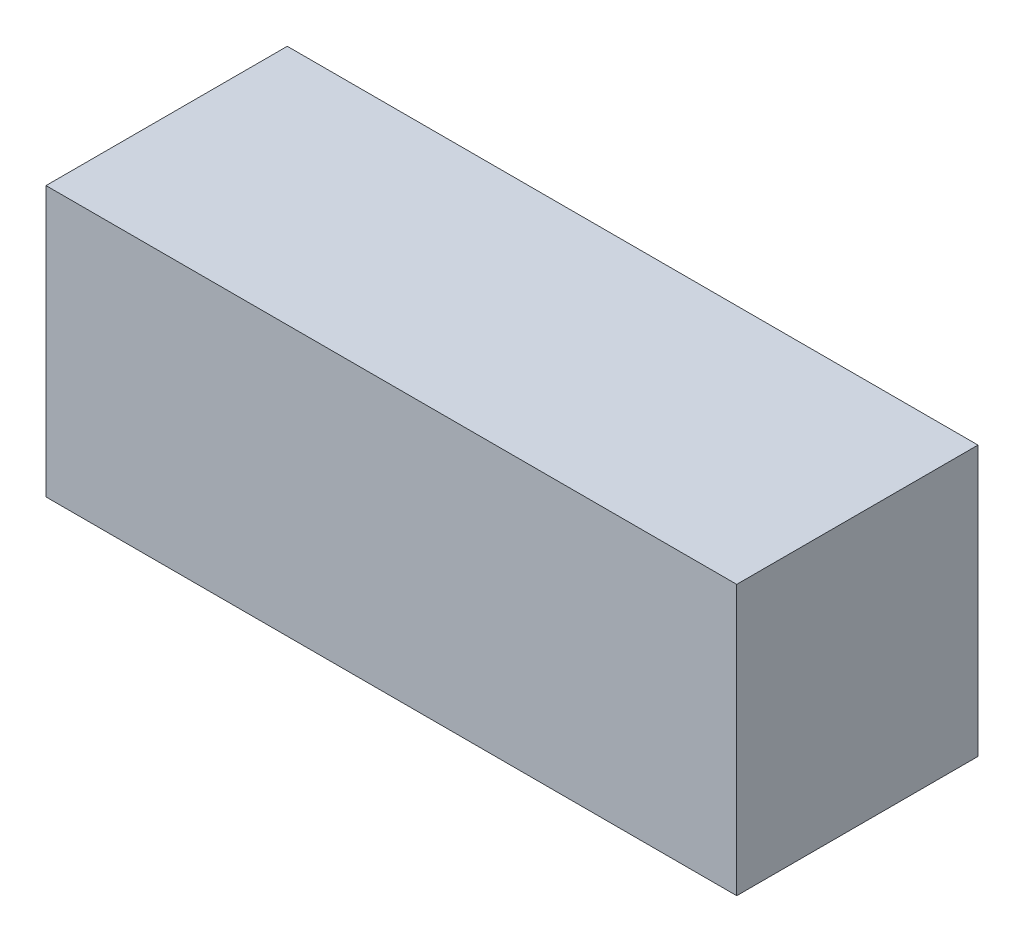
ISO-10303-21;
HEADER;
FILE_DESCRIPTION(('STEP AP214'),'2;1');
FILE_NAME('part.step','',(''),(''),'','','');
FILE_SCHEMA(('AUTOMOTIVE_DESIGN { 1 0 10303 214 1 1 1 1 }'));
ENDSEC;
DATA;
#1=APPLICATION_CONTEXT('core data for automotive mechanical design processes');
#2=APPLICATION_PROTOCOL_DEFINITION('international standard','automotive_design',2000,#1);
#3=PRODUCT_CONTEXT('',#1,'mechanical');
#4=PRODUCT('Part','Part','',(#3));
#5=PRODUCT_RELATED_PRODUCT_CATEGORY('part','',(#4));
#6=PRODUCT_DEFINITION_FORMATION('','',#4);
#7=PRODUCT_DEFINITION_CONTEXT('part definition',#1,'design');
#8=PRODUCT_DEFINITION('design','',#6,#7);
#9=PRODUCT_DEFINITION_SHAPE('','',#8);
#10=(LENGTH_UNIT() NAMED_UNIT(*) SI_UNIT(.MILLI.,.METRE.));
#11=(NAMED_UNIT(*) PLANE_ANGLE_UNIT() SI_UNIT($,.RADIAN.));
#12=(NAMED_UNIT(*) SI_UNIT($,.STERADIAN.) SOLID_ANGLE_UNIT());
#13=UNCERTAINTY_MEASURE_WITH_UNIT(LENGTH_MEASURE(1.E-05),#10,'distance_accuracy_value','');
#14=(GEOMETRIC_REPRESENTATION_CONTEXT(3) GLOBAL_UNCERTAINTY_ASSIGNED_CONTEXT((#13)) GLOBAL_UNIT_ASSIGNED_CONTEXT((#10,
#11,#12)) REPRESENTATION_CONTEXT('',''));
#15=CARTESIAN_POINT('',(0.,0.,0.));
#16=DIRECTION('',(0.,0.,1.));
#17=DIRECTION('',(1.,0.,0.));
#18=AXIS2_PLACEMENT_3D('',#15,#16,#17);
#19=CARTESIAN_POINT('',(0.,57.,0.));
#20=DIRECTION('',(1.,0.,0.));
#21=DIRECTION('',(0.,0.,-1.));
#22=AXIS2_PLACEMENT_3D('',#19,#20,#21);
#23=PLANE('',#22);
#24=DIRECTION('',(0.,0.,1.));
#25=VECTOR('',#24,1.);
#26=CARTESIAN_POINT('',(0.,0.,0.));
#27=LINE('',#26,#25);
#28=CARTESIAN_POINT('',(0.,0.,-51.));
#29=VERTEX_POINT('',#28);
#30=CARTESIAN_POINT('',(0.,0.,0.));
#31=VERTEX_POINT('',#30);
#32=EDGE_CURVE('E96',#29,#31,#27,.T.);
#33=ORIENTED_EDGE('',*,*,#32,.T.);
#34=DIRECTION('',(0.,-1.,0.));
#35=VECTOR('',#34,1.);
#36=CARTESIAN_POINT('',(0.,57.,0.));
#37=LINE('',#36,#35);
#38=CARTESIAN_POINT('',(0.,57.,0.));
#39=VERTEX_POINT('',#38);
#40=EDGE_CURVE('E11',#39,#31,#37,.T.);
#41=ORIENTED_EDGE('',*,*,#40,.F.);
#42=DIRECTION('',(0.,0.,1.));
#43=VECTOR('',#42,1.);
#44=CARTESIAN_POINT('',(0.,57.,0.));
#45=LINE('',#44,#43);
#46=CARTESIAN_POINT('',(0.,57.,-51.));
#47=VERTEX_POINT('',#46);
#48=EDGE_CURVE('E84',#47,#39,#45,.T.);
#49=ORIENTED_EDGE('',*,*,#48,.F.);
#50=DIRECTION('',(0.,-1.,0.));
#51=VECTOR('',#50,1.);
#52=CARTESIAN_POINT('',(0.,57.,-51.));
#53=LINE('',#52,#51);
#54=EDGE_CURVE('E92',#47,#29,#53,.T.);
#55=ORIENTED_EDGE('',*,*,#54,.T.);
#56=EDGE_LOOP('',(#33,#41,#49,#55));
#57=FACE_BOUND('',#56,.T.);
#58=ADVANCED_FACE('F33',(#57),#23,.F.);
#59=CARTESIAN_POINT('',(0.,57.,0.));
#60=DIRECTION('',(0.,0.,-1.));
#61=DIRECTION('',(-1.,0.,0.));
#62=AXIS2_PLACEMENT_3D('',#59,#60,#61);
#63=PLANE('',#62);
#64=DIRECTION('',(1.,0.,0.));
#65=VECTOR('',#64,1.);
#66=CARTESIAN_POINT('',(0.,0.,0.));
#67=LINE('',#66,#65);
#68=CARTESIAN_POINT('',(146.,0.,0.));
#69=VERTEX_POINT('',#68);
#70=EDGE_CURVE('E88',#31,#69,#67,.T.);
#71=ORIENTED_EDGE('',*,*,#70,.T.);
#72=DIRECTION('',(0.,-1.,0.));
#73=VECTOR('',#72,1.);
#74=CARTESIAN_POINT('',(146.,57.,0.));
#75=LINE('',#74,#73);
#76=CARTESIAN_POINT('',(146.,57.,0.));
#77=VERTEX_POINT('',#76);
#78=EDGE_CURVE('E41',#77,#69,#75,.T.);
#79=ORIENTED_EDGE('',*,*,#78,.F.);
#80=DIRECTION('',(1.,0.,0.));
#81=VECTOR('',#80,1.);
#82=CARTESIAN_POINT('',(0.,57.,0.));
#83=LINE('',#82,#81);
#84=EDGE_CURVE('E79',#39,#77,#83,.T.);
#85=ORIENTED_EDGE('',*,*,#84,.F.);
#86=ORIENTED_EDGE('',*,*,#40,.T.);
#87=EDGE_LOOP('',(#71,#79,#85,#86));
#88=FACE_BOUND('',#87,.T.);
#89=ADVANCED_FACE('F87',(#88),#63,.F.);
#90=CARTESIAN_POINT('',(146.,57.,0.));
#91=DIRECTION('',(-1.,0.,0.));
#92=DIRECTION('',(0.,0.,1.));
#93=AXIS2_PLACEMENT_3D('',#90,#91,#92);
#94=PLANE('',#93);
#95=DIRECTION('',(0.,0.,-1.));
#96=VECTOR('',#95,1.);
#97=CARTESIAN_POINT('',(146.,0.,0.));
#98=LINE('',#97,#96);
#99=CARTESIAN_POINT('',(146.,0.,-51.));
#100=VERTEX_POINT('',#99);
#101=EDGE_CURVE('E66',#69,#100,#98,.T.);
#102=ORIENTED_EDGE('',*,*,#101,.T.);
#103=DIRECTION('',(0.,-1.,0.));
#104=VECTOR('',#103,1.);
#105=CARTESIAN_POINT('',(146.,57.,-51.));
#106=LINE('',#105,#104);
#107=CARTESIAN_POINT('',(146.,57.,-51.));
#108=VERTEX_POINT('',#107);
#109=EDGE_CURVE('E89',#108,#100,#106,.T.);
#110=ORIENTED_EDGE('',*,*,#109,.F.);
#111=DIRECTION('',(0.,0.,-1.));
#112=VECTOR('',#111,1.);
#113=CARTESIAN_POINT('',(146.,57.,0.));
#114=LINE('',#113,#112);
#115=EDGE_CURVE('E82',#77,#108,#114,.T.);
#116=ORIENTED_EDGE('',*,*,#115,.F.);
#117=ORIENTED_EDGE('',*,*,#78,.T.);
#118=EDGE_LOOP('',(#102,#110,#116,#117));
#119=FACE_BOUND('',#118,.T.);
#120=ADVANCED_FACE('F90',(#119),#94,.F.);
#121=CARTESIAN_POINT('',(0.,57.,-51.));
#122=DIRECTION('',(0.,0.,1.));
#123=DIRECTION('',(1.,0.,0.));
#124=AXIS2_PLACEMENT_3D('',#121,#122,#123);
#125=PLANE('',#124);
#126=DIRECTION('',(-1.,0.,0.));
#127=VECTOR('',#126,1.);
#128=CARTESIAN_POINT('',(0.,0.,-51.));
#129=LINE('',#128,#127);
#130=EDGE_CURVE('E72',#100,#29,#129,.T.);
#131=ORIENTED_EDGE('',*,*,#130,.T.);
#132=ORIENTED_EDGE('',*,*,#54,.F.);
#133=DIRECTION('',(-1.,0.,0.));
#134=VECTOR('',#133,1.);
#135=CARTESIAN_POINT('',(0.,57.,-51.));
#136=LINE('',#135,#134);
#137=EDGE_CURVE('E49',#108,#47,#136,.T.);
#138=ORIENTED_EDGE('',*,*,#137,.F.);
#139=ORIENTED_EDGE('',*,*,#109,.T.);
#140=EDGE_LOOP('',(#131,#132,#138,#139));
#141=FACE_BOUND('',#140,.T.);
#142=ADVANCED_FACE('F103',(#141),#125,.F.);
#143=CARTESIAN_POINT('',(0.,57.,0.));
#144=DIRECTION('',(0.,-1.,0.));
#145=DIRECTION('',(0.,0.,-1.));
#146=AXIS2_PLACEMENT_3D('',#143,#144,#145);
#147=PLANE('',#146);
#148=ORIENTED_EDGE('',*,*,#48,.T.);
#149=ORIENTED_EDGE('',*,*,#84,.T.);
#150=ORIENTED_EDGE('',*,*,#115,.T.);
#151=ORIENTED_EDGE('',*,*,#137,.T.);
#152=EDGE_LOOP('',(#148,#149,#150,#151));
#153=FACE_BOUND('',#152,.T.);
#154=ADVANCED_FACE('F80',(#153),#147,.F.);
#155=CARTESIAN_POINT('',(0.,0.,0.));
#156=DIRECTION('',(0.,-1.,0.));
#157=DIRECTION('',(0.,0.,-1.));
#158=AXIS2_PLACEMENT_3D('',#155,#156,#157);
#159=PLANE('',#158);
#160=ORIENTED_EDGE('',*,*,#32,.F.);
#161=ORIENTED_EDGE('',*,*,#130,.F.);
#162=ORIENTED_EDGE('',*,*,#101,.F.);
#163=ORIENTED_EDGE('',*,*,#70,.F.);
#164=EDGE_LOOP('',(#160,#161,#162,#163));
#165=FACE_BOUND('',#164,.T.);
#166=ADVANCED_FACE('F106',(#165),#159,.T.);
#167=CLOSED_SHELL('',(#58,#89,#120,#142,#154,#166));
#168=MANIFOLD_SOLID_BREP('B2',#167);
#169=ADVANCED_BREP_SHAPE_REPRESENTATION('',(#18,#168),#14);
#170=SHAPE_DEFINITION_REPRESENTATION(#9,#169);
ENDSEC;
END-ISO-10303-21;
